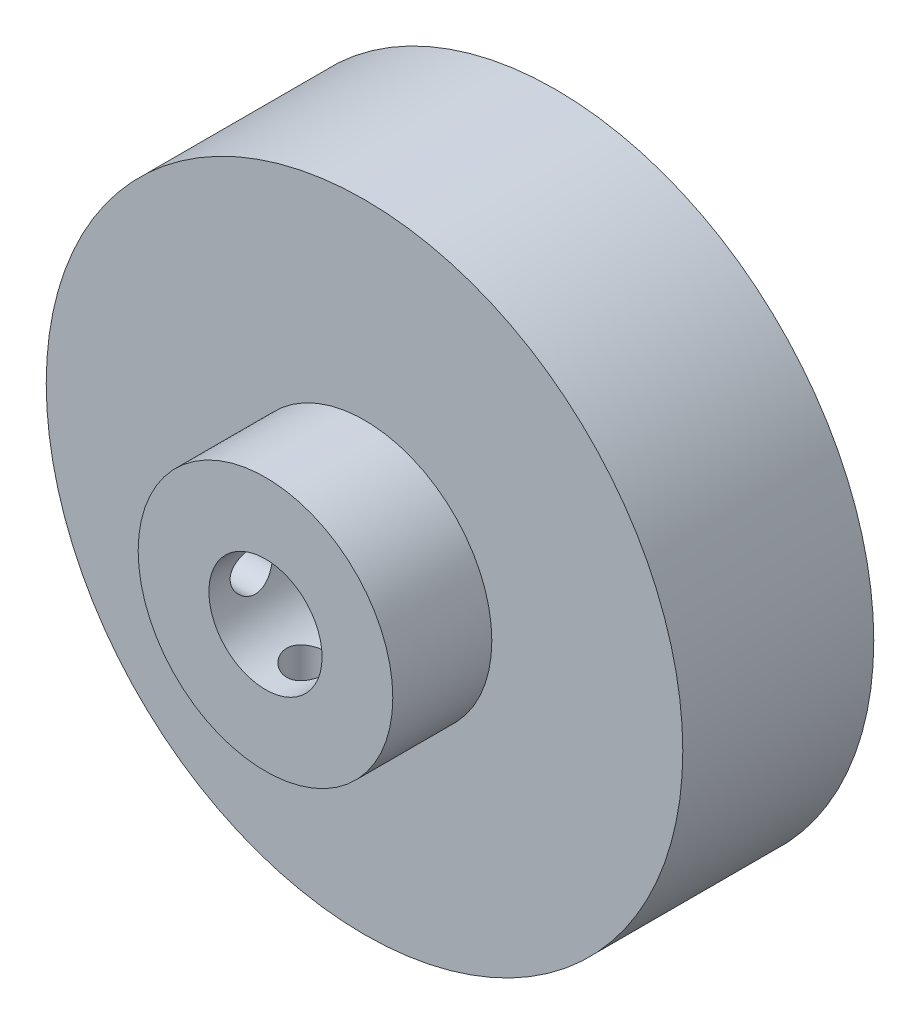
ISO-10303-21;
HEADER;
FILE_DESCRIPTION(('STEP AP214'),'2;1');
FILE_NAME('part.step','',(''),(''),'','','');
FILE_SCHEMA(('AUTOMOTIVE_DESIGN { 1 0 10303 214 1 1 1 1 }'));
ENDSEC;
DATA;
#1=APPLICATION_CONTEXT('core data for automotive mechanical design processes');
#2=APPLICATION_PROTOCOL_DEFINITION('international standard','automotive_design',2000,#1);
#3=PRODUCT_CONTEXT('',#1,'mechanical');
#4=PRODUCT('Part','Part','',(#3));
#5=PRODUCT_RELATED_PRODUCT_CATEGORY('part','',(#4));
#6=PRODUCT_DEFINITION_FORMATION('','',#4);
#7=PRODUCT_DEFINITION_CONTEXT('part definition',#1,'design');
#8=PRODUCT_DEFINITION('design','',#6,#7);
#9=PRODUCT_DEFINITION_SHAPE('','',#8);
#10=(LENGTH_UNIT() NAMED_UNIT(*) SI_UNIT(.MILLI.,.METRE.));
#11=(NAMED_UNIT(*) PLANE_ANGLE_UNIT() SI_UNIT($,.RADIAN.));
#12=(NAMED_UNIT(*) SI_UNIT($,.STERADIAN.) SOLID_ANGLE_UNIT());
#13=UNCERTAINTY_MEASURE_WITH_UNIT(LENGTH_MEASURE(1.E-05),#10,'distance_accuracy_value','');
#14=(GEOMETRIC_REPRESENTATION_CONTEXT(3) GLOBAL_UNCERTAINTY_ASSIGNED_CONTEXT((#13)) GLOBAL_UNIT_ASSIGNED_CONTEXT((#10,
#11,#12)) REPRESENTATION_CONTEXT('',''));
#15=CARTESIAN_POINT('',(0.,0.,0.));
#16=DIRECTION('',(0.,0.,1.));
#17=DIRECTION('',(1.,0.,0.));
#18=AXIS2_PLACEMENT_3D('',#15,#16,#17);
#19=CARTESIAN_POINT('',(0.,0.,13.5));
#20=DIRECTION('',(0.,0.,1.));
#21=DIRECTION('',(1.,0.,0.));
#22=AXIS2_PLACEMENT_3D('',#19,#20,#21);
#23=PLANE('',#22);
#24=CARTESIAN_POINT('',(0.,0.,13.5));
#25=DIRECTION('',(0.,0.,1.));
#26=DIRECTION('',(1.,0.,0.));
#27=AXIS2_PLACEMENT_3D('',#24,#25,#26);
#28=CIRCLE('',#27,22.5);
#29=CARTESIAN_POINT('',(22.5,0.,13.5));
#30=VERTEX_POINT('',#29);
#31=EDGE_CURVE('E10',#30,#30,#28,.T.);
#32=ORIENTED_EDGE('',*,*,#31,.T.);
#33=EDGE_LOOP('',(#32));
#34=FACE_BOUND('',#33,.T.);
#35=CARTESIAN_POINT('',(0.,0.,13.5));
#36=DIRECTION('',(0.,0.,1.));
#37=DIRECTION('',(1.,0.,0.));
#38=AXIS2_PLACEMENT_3D('',#35,#36,#37);
#39=CIRCLE('',#38,9.);
#40=CARTESIAN_POINT('',(9.,0.,13.5));
#41=VERTEX_POINT('',#40);
#42=EDGE_CURVE('E50',#41,#41,#39,.T.);
#43=ORIENTED_EDGE('',*,*,#42,.F.);
#44=EDGE_LOOP('',(#43));
#45=FACE_BOUND('',#44,.T.);
#46=ADVANCED_FACE('F30',(#34,#45),#23,.T.);
#47=CARTESIAN_POINT('',(0.,0.,13.5));
#48=DIRECTION('',(0.,0.,-1.));
#49=DIRECTION('',(-1.,0.,0.));
#50=AXIS2_PLACEMENT_3D('',#47,#48,#49);
#51=CYLINDRICAL_SURFACE('',#50,22.5);
#52=ORIENTED_EDGE('',*,*,#31,.F.);
#53=EDGE_LOOP('',(#52));
#54=FACE_BOUND('',#53,.T.);
#55=CARTESIAN_POINT('',(0.,0.,0.));
#56=DIRECTION('',(0.,0.,1.));
#57=DIRECTION('',(1.,0.,0.));
#58=AXIS2_PLACEMENT_3D('',#55,#56,#57);
#59=CIRCLE('',#58,22.5);
#60=CARTESIAN_POINT('',(22.5,0.,0.));
#61=VERTEX_POINT('',#60);
#62=EDGE_CURVE('E42',#61,#61,#59,.T.);
#63=ORIENTED_EDGE('',*,*,#62,.T.);
#64=EDGE_LOOP('',(#63));
#65=FACE_BOUND('',#64,.T.);
#66=ADVANCED_FACE('F32',(#54,#65),#51,.T.);
#67=CARTESIAN_POINT('',(0.,0.,0.));
#68=DIRECTION('',(0.,0.,1.));
#69=DIRECTION('',(1.,0.,0.));
#70=AXIS2_PLACEMENT_3D('',#67,#68,#69);
#71=PLANE('',#70);
#72=CARTESIAN_POINT('',(0.,0.,0.));
#73=DIRECTION('',(0.,0.,1.));
#74=DIRECTION('',(1.,0.,0.));
#75=AXIS2_PLACEMENT_3D('',#72,#73,#74);
#76=CIRCLE('',#75,4.);
#77=CARTESIAN_POINT('',(4.,0.,0.));
#78=VERTEX_POINT('',#77);
#79=EDGE_CURVE('E79',#78,#78,#76,.T.);
#80=ORIENTED_EDGE('',*,*,#79,.T.);
#81=EDGE_LOOP('',(#80));
#82=FACE_BOUND('',#81,.T.);
#83=ORIENTED_EDGE('',*,*,#62,.F.);
#84=EDGE_LOOP('',(#83));
#85=FACE_BOUND('',#84,.T.);
#86=ADVANCED_FACE('F86',(#82,#85),#71,.F.);
#87=CARTESIAN_POINT('',(0.,0.,20.5));
#88=DIRECTION('',(0.,0.,-1.));
#89=DIRECTION('',(-1.,0.,0.));
#90=AXIS2_PLACEMENT_3D('',#87,#88,#89);
#91=CYLINDRICAL_SURFACE('',#90,9.);
#92=CARTESIAN_POINT('',(-9.,0.,19.));
#93=CARTESIAN_POINT('',(-8.99999856701294,-0.0836345429749289,18.9999966466313));
#94=CARTESIAN_POINT('',(-8.9988220674782,-0.167314729103292,18.9929816350186));
#95=CARTESIAN_POINT('',(-8.99424206964832,-0.332328133003825,18.9651186047408));
#96=CARTESIAN_POINT('',(-8.99083652354334,-0.413659120775548,18.944257865853));
#97=CARTESIAN_POINT('',(-8.9821804094187,-0.571562848327586,18.8893507308443));
#98=CARTESIAN_POINT('',(-8.97693135095516,-0.64813942105914,18.8553151206157));
#99=CARTESIAN_POINT('',(-8.96516536249242,-0.794485105186767,18.7750526247686));
#100=CARTESIAN_POINT('',(-8.9586485775266,-0.864254993927154,18.7288271335102));
#101=CARTESIAN_POINT('',(-8.94499990474988,-0.995683568575007,18.6250269497077));
#102=CARTESIAN_POINT('',(-8.93786323088914,-1.05726774212098,18.5673585312183));
#103=CARTESIAN_POINT('',(-8.92381576126039,-1.16993309919596,18.4425112189163));
#104=CARTESIAN_POINT('',(-8.916904979776,-1.22101361963458,18.375331725126));
#105=CARTESIAN_POINT('',(-8.90404539455868,-1.31152027536308,18.2328574202818));
#106=CARTESIAN_POINT('',(-8.89810277454982,-1.3508727317166,18.1575151979171));
#107=CARTESIAN_POINT('',(-8.88791873876805,-1.41633501924673,18.0011742614196));
#108=CARTESIAN_POINT('',(-8.88367720808584,-1.44244574493937,17.9201759297934));
#109=CARTESIAN_POINT('',(-8.87742322105653,-1.48044862667089,17.7556118350861));
#110=CARTESIAN_POINT('',(-8.8753906109142,-1.49246941748124,17.6720765580992));
#111=CARTESIAN_POINT('',(-8.87372363361989,-1.50235003517393,17.5041518338699));
#112=CARTESIAN_POINT('',(-8.87408909674328,-1.5002108642334,17.4197624474996));
#113=CARTESIAN_POINT('',(-8.87715857318133,-1.48193705903769,17.2534432832347));
#114=CARTESIAN_POINT('',(-8.8798384399135,-1.46594692913386,17.1714971178729));
#115=CARTESIAN_POINT('',(-8.88719697126605,-1.42065188424207,17.0114672093025));
#116=CARTESIAN_POINT('',(-8.89187570443963,-1.39134651259184,16.9333835986669));
#117=CARTESIAN_POINT('',(-8.9027308760046,-1.32010634765635,16.7828627059354));
#118=CARTESIAN_POINT('',(-8.90891440264395,-1.27811154832783,16.7104543563513));
#119=CARTESIAN_POINT('',(-8.92207751049005,-1.18272721053446,16.573657359677));
#120=CARTESIAN_POINT('',(-8.92905715592572,-1.12933675239257,16.509269360527));
#121=CARTESIAN_POINT('',(-8.94313216727871,-1.01188932729544,16.3895043485156));
#122=CARTESIAN_POINT('',(-8.95022789538991,-0.94770837832388,16.334248888876));
#123=CARTESIAN_POINT('',(-8.96365560838034,-0.810921149388992,16.2352733424008));
#124=CARTESIAN_POINT('',(-8.96998758833847,-0.738314815143857,16.1915533298901));
#125=CARTESIAN_POINT('',(-8.98118335735747,-0.58662354970003,16.1168786637182));
#126=CARTESIAN_POINT('',(-8.98604591044468,-0.5075332353388,16.0859347484012));
#127=CARTESIAN_POINT('',(-8.99374501807596,-0.345179007361641,16.0378034708524));
#128=CARTESIAN_POINT('',(-8.99658174210284,-0.261915443507683,16.0206149578158));
#129=CARTESIAN_POINT('',(-8.99988677905612,-0.0946259407809758,16.0006471849233));
#130=CARTESIAN_POINT('',(-9.00038251807671,-0.0106204422906083,15.9977010569166));
#131=CARTESIAN_POINT('',(-8.99902484652702,0.156683863733931,16.0058568066569));
#132=CARTESIAN_POINT('',(-8.99717152634471,0.239982698335222,16.0169581438802));
#133=CARTESIAN_POINT('',(-8.99134096162921,0.402993705328058,16.0527549096013));
#134=CARTESIAN_POINT('',(-8.98737662880787,0.482724521031227,16.0773677250341));
#135=CARTESIAN_POINT('',(-8.97776678673215,0.636928130916265,16.1394007109197));
#136=CARTESIAN_POINT('',(-8.97212118307212,0.71140062954583,16.1768216005812));
#137=CARTESIAN_POINT('',(-8.95970709781445,0.853698413681374,16.2637906748181));
#138=CARTESIAN_POINT('',(-8.95292913532213,0.921459150562287,16.3134430937004));
#139=CARTESIAN_POINT('',(-8.93903080435141,1.04774615130161,16.423322389231));
#140=CARTESIAN_POINT('',(-8.93191041102928,1.10627174381795,16.483550033966));
#141=CARTESIAN_POINT('',(-8.91804105141507,1.2130456677948,16.6136185288429));
#142=CARTESIAN_POINT('',(-8.91129669682264,1.26118125666823,16.6835524993086));
#143=CARTESIAN_POINT('',(-8.8990291786673,1.34502138617699,16.8306117814831));
#144=CARTESIAN_POINT('',(-8.89350597639612,1.38072632086189,16.9077368651365));
#145=CARTESIAN_POINT('',(-8.88434072218623,1.43852299888389,17.0666738396873));
#146=CARTESIAN_POINT('',(-8.88069092586639,1.46067085952877,17.1484648570183));
#147=CARTESIAN_POINT('',(-8.87566630101156,1.49090127226697,17.3146720775331));
#148=CARTESIAN_POINT('',(-8.87429127469633,1.4989850471677,17.3990880518392));
#149=CARTESIAN_POINT('',(-8.87398039850407,1.50082371962841,17.5670230995774));
#150=CARTESIAN_POINT('',(-8.8750143390339,1.49475608167511,17.6505402271452));
#151=CARTESIAN_POINT('',(-8.87933868872237,1.46884790337411,17.8153475488305));
#152=CARTESIAN_POINT('',(-8.88262909056728,1.44900740766749,17.8966377501651));
#153=CARTESIAN_POINT('',(-8.89108413769031,1.39618469375694,18.0546150623756));
#154=CARTESIAN_POINT('',(-8.89624660331802,1.36321775436027,18.1313074060336));
#155=CARTESIAN_POINT('',(-8.90786621353324,1.28509620234955,18.2781014015169));
#156=CARTESIAN_POINT('',(-8.91432342233039,1.23994098524914,18.3482027262233));
#157=CARTESIAN_POINT('',(-8.92790072427373,1.13809133062329,18.4807213498647));
#158=CARTESIAN_POINT('',(-8.93502777345781,1.08126633815619,18.5430376100202));
#159=CARTESIAN_POINT('',(-8.94908623416505,0.957965418828139,18.657310962685));
#160=CARTESIAN_POINT('',(-8.95601760015928,0.891487267747582,18.7092656611829));
#161=CARTESIAN_POINT('',(-8.96895917785332,0.750221501784169,18.80166896092));
#162=CARTESIAN_POINT('',(-8.97496269751862,0.675379672519692,18.8420356235878));
#163=CARTESIAN_POINT('',(-8.98530700561065,0.51990784162739,18.909561690766));
#164=CARTESIAN_POINT('',(-8.98964944906489,0.439283696898006,18.9367342486478));
#165=CARTESIAN_POINT('',(-8.99523474499773,0.298621986027241,18.971203164476));
#166=CARTESIAN_POINT('',(-8.99701216364015,0.239435298179069,18.9819846817696));
#167=CARTESIAN_POINT('',(-8.99939529591672,0.120173586191886,18.9963842427069));
#168=CARTESIAN_POINT('',(-9.00000102972385,0.0600985773650966,19.0000024096824));
#169=CARTESIAN_POINT('',(-9.,0.,19.));
#170=B_SPLINE_CURVE_WITH_KNOTS('',3,(#92,#93,#94,#95,#96,#97,#98,#99,#100,#101,#102,#103,#104,
#105,#106,#107,#108,#109,#110,#111,#112,#113,#114,#115,#116,#117,#118,#119,#120,#121,#122,#123,
#124,#125,#126,#127,#128,#129,#130,#131,#132,#133,#134,#135,#136,#137,#138,#139,#140,#141,#142,
#143,#144,#145,#146,#147,#148,#149,#150,#151,#152,#153,#154,#155,#156,#157,#158,#159,#160,#161,
#162,#163,#164,#165,#166,#167,#168,#169),.UNSPECIFIED.,.T.,.F.,(4,2,2,2,2,2,2,2,2,2,2,2,2,2,2,2,
2,2,2,2,2,2,2,2,2,2,2,2,2,2,2,2,2,2,2,2,2,2,4),(0.,0.250683950963106,0.501598527417252,
0.752308120215162,1.00298904760487,1.25581494637399,1.50865680101914,1.76305512494304,
2.01743626125709,2.26947646262054,2.52149882592532,2.77092313056246,3.02035599015229,
3.27098733979535,3.52163892408344,3.77539661946796,4.02915594981508,4.28312813349542,
4.53707906712689,4.78804730094838,5.03900587821516,5.2884468420385,5.5379018149564,
5.78956095376215,6.0412383783257,6.29552293204572,6.54979942425566,6.80301613405064,
7.05621082671971,7.3062474571362,7.5562832771288,7.80602890935734,8.05578693017602,
8.30850830516036,8.56128800327384,8.8158133896432,9.07008451278043,9.25022548898411,
9.43036336366181),.UNSPECIFIED.);
#171=CARTESIAN_POINT('',(-9.,0.,19.));
#172=VERTEX_POINT('',#171);
#173=EDGE_CURVE('E58',#172,#172,#170,.T.);
#174=ORIENTED_EDGE('',*,*,#173,.T.);
#175=EDGE_LOOP('',(#174));
#176=FACE_BOUND('',#175,.T.);
#177=CARTESIAN_POINT('',(0.,-9.,19.));
#178=CARTESIAN_POINT('',(0.0836345429749311,-8.99999856701294,18.9999966466313));
#179=CARTESIAN_POINT('',(0.167314729103295,-8.9988220674782,18.9929816350187));
#180=CARTESIAN_POINT('',(0.332328133003828,-8.99424206964832,18.9651186047408));
#181=CARTESIAN_POINT('',(0.413659120775551,-8.99083652354334,18.944257865853));
#182=CARTESIAN_POINT('',(0.571562848327589,-8.9821804094187,18.8893507308443));
#183=CARTESIAN_POINT('',(0.648139421059144,-8.97693135095516,18.8553151206157));
#184=CARTESIAN_POINT('',(0.794485105186771,-8.96516536249242,18.7750526247686));
#185=CARTESIAN_POINT('',(0.864254993927159,-8.9586485775266,18.7288271335102));
#186=CARTESIAN_POINT('',(0.995683568575012,-8.94499990474988,18.6250269497077));
#187=CARTESIAN_POINT('',(1.05726774212098,-8.93786323088914,18.5673585312183));
#188=CARTESIAN_POINT('',(1.16993309919596,-8.92381576126039,18.4425112189163));
#189=CARTESIAN_POINT('',(1.22101361963459,-8.916904979776,18.375331725126));
#190=CARTESIAN_POINT('',(1.31152027536308,-8.90404539455868,18.2328574202818));
#191=CARTESIAN_POINT('',(1.3508727317166,-8.89810277454981,18.1575151979171));
#192=CARTESIAN_POINT('',(1.41633501924674,-8.88791873876805,18.0011742614196));
#193=CARTESIAN_POINT('',(1.44244574493937,-8.88367720808584,17.9201759297934));
#194=CARTESIAN_POINT('',(1.48044862667089,-8.87742322105653,17.7556118350861));
#195=CARTESIAN_POINT('',(1.49246941748125,-8.8753906109142,17.6720765580992));
#196=CARTESIAN_POINT('',(1.50235003517393,-8.87372363361989,17.5041518338699));
#197=CARTESIAN_POINT('',(1.5002108642334,-8.87408909674328,17.4197624474996));
#198=CARTESIAN_POINT('',(1.4819370590377,-8.87715857318133,17.2534432832347));
#199=CARTESIAN_POINT('',(1.46594692913387,-8.8798384399135,17.1714971178729));
#200=CARTESIAN_POINT('',(1.42065188424207,-8.88719697126605,17.0114672093025));
#201=CARTESIAN_POINT('',(1.39134651259185,-8.89187570443963,16.9333835986669));
#202=CARTESIAN_POINT('',(1.32010634765635,-8.9027308760046,16.7828627059354));
#203=CARTESIAN_POINT('',(1.27811154832783,-8.90891440264395,16.7104543563513));
#204=CARTESIAN_POINT('',(1.18272721053446,-8.92207751049005,16.573657359677));
#205=CARTESIAN_POINT('',(1.12933675239257,-8.92905715592572,16.509269360527));
#206=CARTESIAN_POINT('',(1.01188932729544,-8.94313216727871,16.3895043485156));
#207=CARTESIAN_POINT('',(0.94770837832388,-8.95022789538991,16.334248888876));
#208=CARTESIAN_POINT('',(0.810921149388991,-8.96365560838034,16.2352733424008));
#209=CARTESIAN_POINT('',(0.738314815143856,-8.96998758833847,16.1915533298901));
#210=CARTESIAN_POINT('',(0.586623549700029,-8.98118335735747,16.1168786637182));
#211=CARTESIAN_POINT('',(0.507533235338799,-8.98604591044468,16.0859347484012));
#212=CARTESIAN_POINT('',(0.345179007361641,-8.99374501807596,16.0378034708524));
#213=CARTESIAN_POINT('',(0.261915443507683,-8.99658174210284,16.0206149578158));
#214=CARTESIAN_POINT('',(0.0946259407809755,-8.99988677905612,16.0006471849233));
#215=CARTESIAN_POINT('',(0.0106204422906077,-9.00038251807671,15.9977010569166));
#216=CARTESIAN_POINT('',(-0.156683863733932,-8.99902484652702,16.0058568066569));
#217=CARTESIAN_POINT('',(-0.239982698335223,-8.99717152634471,16.0169581438802));
#218=CARTESIAN_POINT('',(-0.402993705328058,-8.99134096162921,16.0527549096013));
#219=CARTESIAN_POINT('',(-0.482724521031227,-8.98737662880787,16.0773677250341));
#220=CARTESIAN_POINT('',(-0.636928130916266,-8.97776678673215,16.1394007109197));
#221=CARTESIAN_POINT('',(-0.711400629545831,-8.97212118307212,16.1768216005812));
#222=CARTESIAN_POINT('',(-0.853698413681375,-8.95970709781444,16.2637906748181));
#223=CARTESIAN_POINT('',(-0.921459150562288,-8.95292913532213,16.3134430937004));
#224=CARTESIAN_POINT('',(-1.04774615130161,-8.93903080435141,16.423322389231));
#225=CARTESIAN_POINT('',(-1.10627174381795,-8.93191041102928,16.483550033966));
#226=CARTESIAN_POINT('',(-1.2130456677948,-8.91804105141507,16.6136185288429));
#227=CARTESIAN_POINT('',(-1.26118125666823,-8.91129669682264,16.6835524993086));
#228=CARTESIAN_POINT('',(-1.34502138617699,-8.8990291786673,16.8306117814831));
#229=CARTESIAN_POINT('',(-1.38072632086189,-8.89350597639612,16.9077368651365));
#230=CARTESIAN_POINT('',(-1.43852299888389,-8.88434072218623,17.0666738396873));
#231=CARTESIAN_POINT('',(-1.46067085952877,-8.88069092586639,17.1484648570183));
#232=CARTESIAN_POINT('',(-1.49090127226697,-8.87566630101156,17.3146720775331));
#233=CARTESIAN_POINT('',(-1.4989850471677,-8.87429127469633,17.3990880518392));
#234=CARTESIAN_POINT('',(-1.50082371962841,-8.87398039850407,17.5670230995775));
#235=CARTESIAN_POINT('',(-1.49475608167511,-8.8750143390339,17.6505402271452));
#236=CARTESIAN_POINT('',(-1.46884790337411,-8.87933868872237,17.8153475488305));
#237=CARTESIAN_POINT('',(-1.44900740766749,-8.88262909056728,17.8966377501651));
#238=CARTESIAN_POINT('',(-1.39618469375694,-8.89108413769031,18.0546150623756));
#239=CARTESIAN_POINT('',(-1.36321775436026,-8.89624660331802,18.1313074060336));
#240=CARTESIAN_POINT('',(-1.28509620234954,-8.90786621353324,18.2781014015169));
#241=CARTESIAN_POINT('',(-1.23994098524914,-8.9143234223304,18.3482027262233));
#242=CARTESIAN_POINT('',(-1.13809133062329,-8.92790072427373,18.4807213498647));
#243=CARTESIAN_POINT('',(-1.08126633815619,-8.93502777345781,18.5430376100202));
#244=CARTESIAN_POINT('',(-0.957965418828136,-8.94908623416504,18.657310962685));
#245=CARTESIAN_POINT('',(-0.89148726774758,-8.95601760015928,18.7092656611829));
#246=CARTESIAN_POINT('',(-0.750221501784167,-8.96895917785332,18.80166896092));
#247=CARTESIAN_POINT('',(-0.675379672519689,-8.97496269751862,18.8420356235878));
#248=CARTESIAN_POINT('',(-0.519907841627385,-8.98530700561065,18.909561690766));
#249=CARTESIAN_POINT('',(-0.439283696898002,-8.98964944906489,18.9367342486478));
#250=CARTESIAN_POINT('',(-0.298621986027236,-8.99523474499773,18.971203164476));
#251=CARTESIAN_POINT('',(-0.239435298179064,-8.99701216364015,18.9819846817696));
#252=CARTESIAN_POINT('',(-0.120173586191882,-8.99939529591673,18.9963842427069));
#253=CARTESIAN_POINT('',(-0.0600985773650939,-9.00000102972385,19.0000024096824));
#254=CARTESIAN_POINT('',(0.,-9.,19.));
#255=B_SPLINE_CURVE_WITH_KNOTS('',3,(#177,#178,#179,#180,#181,#182,#183,#184,#185,#186,#187,
#188,#189,#190,#191,#192,#193,#194,#195,#196,#197,#198,#199,#200,#201,#202,#203,#204,#205,#206,
#207,#208,#209,#210,#211,#212,#213,#214,#215,#216,#217,#218,#219,#220,#221,#222,#223,#224,#225,
#226,#227,#228,#229,#230,#231,#232,#233,#234,#235,#236,#237,#238,#239,#240,#241,#242,#243,#244,
#245,#246,#247,#248,#249,#250,#251,#252,#253,#254),.UNSPECIFIED.,.T.,.F.,(4,2,2,2,2,2,2,2,2,2,2,
2,2,2,2,2,2,2,2,2,2,2,2,2,2,2,2,2,2,2,2,2,2,2,2,2,2,2,4),(0.,0.250683950963106,
0.501598527417254,0.752308120215164,1.00298904760488,1.255814946374,1.50865680101914,
1.76305512494304,2.01743626125709,2.26947646262055,2.52149882592532,2.77092313056246,
3.0203559901523,3.27098733979535,3.52163892408345,3.77539661946796,4.02915594981509,
4.28312813349543,4.5370790671269,4.78804730094839,5.03900587821517,5.2884468420385,
5.53790181495641,5.78956095376215,6.04123837832571,6.29552293204572,6.54979942425567,
6.80301613405065,7.05621082671972,7.30624745713622,7.55628327712881,7.80602890935735,
8.05578693017603,8.30850830516036,8.56128800327385,8.81581338964322,9.07008451278045,
9.25022548898413,9.43036336366182),.UNSPECIFIED.);
#256=CARTESIAN_POINT('',(0.,-9.,19.));
#257=VERTEX_POINT('',#256);
#258=EDGE_CURVE('E57',#257,#257,#255,.T.);
#259=ORIENTED_EDGE('',*,*,#258,.T.);
#260=EDGE_LOOP('',(#259));
#261=FACE_BOUND('',#260,.T.);
#262=CARTESIAN_POINT('',(0.,0.,20.5));
#263=DIRECTION('',(0.,0.,1.));
#264=DIRECTION('',(1.,0.,0.));
#265=AXIS2_PLACEMENT_3D('',#262,#263,#264);
#266=CIRCLE('',#265,9.);
#267=CARTESIAN_POINT('',(9.,0.,20.5));
#268=VERTEX_POINT('',#267);
#269=EDGE_CURVE('E47',#268,#268,#266,.T.);
#270=ORIENTED_EDGE('',*,*,#269,.F.);
#271=EDGE_LOOP('',(#270));
#272=FACE_BOUND('',#271,.T.);
#273=ORIENTED_EDGE('',*,*,#42,.T.);
#274=EDGE_LOOP('',(#273));
#275=FACE_BOUND('',#274,.T.);
#276=ADVANCED_FACE('F81',(#176,#261,#272,#275),#91,.T.);
#277=CARTESIAN_POINT('',(0.,0.,20.5));
#278=DIRECTION('',(0.,0.,1.));
#279=DIRECTION('',(1.,0.,0.));
#280=AXIS2_PLACEMENT_3D('',#277,#278,#279);
#281=PLANE('',#280);
#282=CARTESIAN_POINT('',(0.,0.,20.5));
#283=DIRECTION('',(0.,0.,1.));
#284=DIRECTION('',(1.,0.,0.));
#285=AXIS2_PLACEMENT_3D('',#282,#283,#284);
#286=CIRCLE('',#285,4.);
#287=CARTESIAN_POINT('',(4.,0.,20.5));
#288=VERTEX_POINT('',#287);
#289=EDGE_CURVE('E76',#288,#288,#286,.T.);
#290=ORIENTED_EDGE('',*,*,#289,.F.);
#291=EDGE_LOOP('',(#290));
#292=FACE_BOUND('',#291,.T.);
#293=ORIENTED_EDGE('',*,*,#269,.T.);
#294=EDGE_LOOP('',(#293));
#295=FACE_BOUND('',#294,.T.);
#296=ADVANCED_FACE('F85',(#292,#295),#281,.T.);
#297=CARTESIAN_POINT('',(0.,0.,0.));
#298=DIRECTION('',(0.,0.,1.));
#299=DIRECTION('',(1.,0.,0.));
#300=AXIS2_PLACEMENT_3D('',#297,#298,#299);
#301=CYLINDRICAL_SURFACE('',#300,4.);
#302=CARTESIAN_POINT('',(-4.,0.,16.));
#303=CARTESIAN_POINT('',(-4.00000217456152,-0.0812350589378531,15.9999970976969));
#304=CARTESIAN_POINT('',(-3.99750379283184,-0.162450241781792,16.0066197602484));
#305=CARTESIAN_POINT('',(-3.98778696006928,-0.322453452352361,16.0328281952699));
#306=CARTESIAN_POINT('',(-3.98056918893993,-0.401241827987615,16.0524121004706));
#307=CARTESIAN_POINT('',(-3.96218832391545,-0.554060784990878,16.1037530017718));
#308=CARTESIAN_POINT('',(-3.9510328434944,-0.628100224162276,16.1354865168218));
#309=CARTESIAN_POINT('',(-3.92588767765353,-0.769799310160252,16.2101064130158));
#310=CARTESIAN_POINT('',(-3.91189723227548,-0.837457239177878,16.2529957855442));
#311=CARTESIAN_POINT('',(-3.88186246971217,-0.967346417045824,16.3506125310709));
#312=CARTESIAN_POINT('',(-3.86576002583566,-1.02927073015119,16.4057302622594));
#313=CARTESIAN_POINT('',(-3.83360220871327,-1.14324421474363,16.5254104346588));
#314=CARTESIAN_POINT('',(-3.81754685135033,-1.19529036359202,16.5899757560879));
#315=CARTESIAN_POINT('',(-3.78662470617731,-1.28998202215985,16.7297174675232));
#316=CARTESIAN_POINT('',(-3.77182648820818,-1.3321939319576,16.8052043665458));
#317=CARTESIAN_POINT('',(-3.74599860237433,-1.40318646334084,16.9628483541685));
#318=CARTESIAN_POINT('',(-3.73496742975881,-1.43197244961239,17.0450027631551));
#319=CARTESIAN_POINT('',(-3.71854412824136,-1.47408431017549,17.2101167402582));
#320=CARTESIAN_POINT('',(-3.71293924350838,-1.48799593218558,17.2929050384354));
#321=CARTESIAN_POINT('',(-3.70738061461215,-1.50179556531648,17.4598161579938));
#322=CARTESIAN_POINT('',(-3.70742453659305,-1.50168936802631,17.5439384138745));
#323=CARTESIAN_POINT('',(-3.71297511632055,-1.48790429610018,17.705769525213));
#324=CARTESIAN_POINT('',(-3.71815468871122,-1.47503808509004,17.7835609060442));
#325=CARTESIAN_POINT('',(-3.73284938059529,-1.4374416786833,17.9357871504053));
#326=CARTESIAN_POINT('',(-3.74236515298863,-1.41270969663258,18.0102215066139));
#327=CARTESIAN_POINT('',(-3.76485702190253,-1.35163748571904,18.1552770677282));
#328=CARTESIAN_POINT('',(-3.77789517988166,-1.31508648737101,18.2257994861213));
#329=CARTESIAN_POINT('',(-3.80594210139319,-1.23156073762698,18.359945737591));
#330=CARTESIAN_POINT('',(-3.82095154457158,-1.18458238728897,18.4235671775197));
#331=CARTESIAN_POINT('',(-3.85248038859113,-1.07781780766549,18.5466036636509));
#332=CARTESIAN_POINT('',(-3.86903347455671,-1.01738298716956,18.6054486407481));
#333=CARTESIAN_POINT('',(-3.90091728164085,-0.887312590819023,18.7123379662058));
#334=CARTESIAN_POINT('',(-3.91624781465952,-0.817675603497366,18.7603806546057));
#335=CARTESIAN_POINT('',(-3.9442639480908,-0.66972343699242,18.8449303970625));
#336=CARTESIAN_POINT('',(-3.95690498259616,-0.59129071384472,18.8812475812211));
#337=CARTESIAN_POINT('',(-3.97778718326962,-0.428836850524585,18.93998260427));
#338=CARTESIAN_POINT('',(-3.98603030341493,-0.344818210845769,18.9624066165611));
#339=CARTESIAN_POINT('',(-3.99684443228065,-0.178375243148668,18.9916227875419));
#340=CARTESIAN_POINT('',(-3.99969369025686,-0.0961036195622122,18.9991826063825));
#341=CARTESIAN_POINT('',(-4.00025893700126,0.0685724752550217,19.0006910638999));
#342=CARTESIAN_POINT('',(-3.99797606386863,0.150976912983371,18.9946427203168));
#343=CARTESIAN_POINT('',(-3.98871709772643,0.310262048561857,18.9696899576913));
#344=CARTESIAN_POINT('',(-3.98192470962305,0.387233328007334,18.9512884562629));
#345=CARTESIAN_POINT('',(-3.96451477091717,0.536941754957218,18.9028139274527));
#346=CARTESIAN_POINT('',(-3.9538967228203,0.609678350347531,18.872739382052));
#347=CARTESIAN_POINT('',(-3.92949624407682,0.751247765110153,18.8008135875605));
#348=CARTESIAN_POINT('',(-3.91563000209348,0.819903083557793,18.7586422707766));
#349=CARTESIAN_POINT('',(-3.88626671564664,0.949392711726624,18.6640818968284));
#350=CARTESIAN_POINT('',(-3.87076907009516,1.01022412027045,18.6116890674549));
#351=CARTESIAN_POINT('',(-3.8387332949099,1.12603079874454,18.4945958778757));
#352=CARTESIAN_POINT('',(-3.82218696503729,1.18046154123568,18.4293578172273));
#353=CARTESIAN_POINT('',(-3.79078815746854,1.27771050031903,18.2903486152923));
#354=CARTESIAN_POINT('',(-3.77593583194399,1.32052767414518,18.2165767086115));
#355=CARTESIAN_POINT('',(-3.74966829822463,1.39337773518998,18.0619840132277));
#356=CARTESIAN_POINT('',(-3.73826760328493,1.42335685446918,17.9811352540896));
#357=CARTESIAN_POINT('',(-3.72054032891005,1.46907883466889,17.8149902363122));
#358=CARTESIAN_POINT('',(-3.71421061057491,1.48483050305535,17.7296967638019));
#359=CARTESIAN_POINT('',(-3.70775894792573,1.50086347097839,17.5629838404589));
#360=CARTESIAN_POINT('',(-3.70726444523341,1.50207331495837,17.4816673682831));
#361=CARTESIAN_POINT('',(-3.71158412745292,1.49136715641593,17.3200546837238));
#362=CARTESIAN_POINT('',(-3.71639780898899,1.47945239850124,17.2397583753284));
#363=CARTESIAN_POINT('',(-3.73048141585432,1.44355815630242,17.0849527732834));
#364=CARTESIAN_POINT('',(-3.73961085376663,1.41995798316524,17.0103416537547));
#365=CARTESIAN_POINT('',(-3.76121548297845,1.3616969677992,16.8660944915056));
#366=CARTESIAN_POINT('',(-3.77369151995215,1.32703332944945,16.7964597119299));
#367=CARTESIAN_POINT('',(-3.80139723903965,1.24552075938154,16.6601732103024));
#368=CARTESIAN_POINT('',(-3.81673698440964,1.1981283280301,16.5938692032001));
#369=CARTESIAN_POINT('',(-3.84806246757177,1.09334485729906,16.4698584390288));
#370=CARTESIAN_POINT('',(-3.86404840943145,1.03595064012808,16.4121544252132));
#371=CARTESIAN_POINT('',(-3.89590424609881,0.909080396784623,16.3037980441782));
#372=CARTESIAN_POINT('',(-3.91172104900645,0.839118644212993,16.2536962465653));
#373=CARTESIAN_POINT('',(-3.94054514457031,0.691213223200822,16.1659773447234));
#374=CARTESIAN_POINT('',(-3.95355221851559,0.613268934090622,16.1283612122636));
#375=CARTESIAN_POINT('',(-3.9757429260668,0.447999082002312,16.0656231709517));
#376=CARTESIAN_POINT('',(-3.98473657158356,0.360413422234208,16.0411129353981));
#377=CARTESIAN_POINT('',(-3.99686242179587,0.181875733606381,16.0083070400793));
#378=CARTESIAN_POINT('',(-3.99999756603967,0.0909254163648582,16.0000032485127));
#379=CARTESIAN_POINT('',(-4.,0.,16.));
#380=B_SPLINE_CURVE_WITH_KNOTS('',3,(#302,#303,#304,#305,#306,#307,#308,#309,#310,#311,#312,
#313,#314,#315,#316,#317,#318,#319,#320,#321,#322,#323,#324,#325,#326,#327,#328,#329,#330,#331,
#332,#333,#334,#335,#336,#337,#338,#339,#340,#341,#342,#343,#344,#345,#346,#347,#348,#349,#350,
#351,#352,#353,#354,#355,#356,#357,#358,#359,#360,#361,#362,#363,#364,#365,#366,#367,#368,#369,
#370,#371,#372,#373,#374,#375,#376,#377,#378,#379),.UNSPECIFIED.,.T.,.F.,(4,2,2,2,2,2,2,2,2,2,2,
2,2,2,2,2,2,2,2,2,2,2,2,2,2,2,2,2,2,2,2,2,2,2,2,2,2,2,4),(0.,0.243369801560559,
0.486704549530459,0.729571369213571,0.972503379609487,1.22473618582715,1.47704604925621,
1.73896674501658,2.00078269352134,2.25185874416901,2.50283106079707,2.73878345119971,
2.97477138060589,3.21522408387018,3.45575990744258,3.71246153335812,3.96920257905066,
4.22991375286075,4.49050899698846,4.73725019635925,4.98393668390521,5.2211443792384,
5.45838293254454,5.702592218596,5.94689180019868,6.20536519455658,6.46386178920141,
6.72343066727204,6.98283874956507,7.22558763480252,7.46831350211259,7.70363142426534,
7.93900886656507,8.18672471884272,8.43451941997063,8.69572329654039,8.95694749805102,
9.22948515032043,9.50188601796128),.UNSPECIFIED.);
#381=CARTESIAN_POINT('',(-4.,0.,16.));
#382=VERTEX_POINT('',#381);
#383=EDGE_CURVE('E34',#382,#382,#380,.T.);
#384=ORIENTED_EDGE('',*,*,#383,.T.);
#385=EDGE_LOOP('',(#384));
#386=FACE_BOUND('',#385,.T.);
#387=CARTESIAN_POINT('',(0.,-4.,19.));
#388=CARTESIAN_POINT('',(-0.0812350589378508,-4.00000217456152,19.0000029023031));
#389=CARTESIAN_POINT('',(-0.16245024178179,-3.99750379283184,18.9933802397516));
#390=CARTESIAN_POINT('',(-0.322453452352359,-3.98778696006928,18.9671718047301));
#391=CARTESIAN_POINT('',(-0.401241827987614,-3.98056918893993,18.9475878995294));
#392=CARTESIAN_POINT('',(-0.554060784990877,-3.96218832391545,18.8962469982282));
#393=CARTESIAN_POINT('',(-0.628100224162276,-3.9510328434944,18.8645134831782));
#394=CARTESIAN_POINT('',(-0.769799310160252,-3.92588767765353,18.7898935869842));
#395=CARTESIAN_POINT('',(-0.837457239177878,-3.91189723227548,18.7470042144558));
#396=CARTESIAN_POINT('',(-0.967346417045824,-3.88186246971217,18.6493874689291));
#397=CARTESIAN_POINT('',(-1.02927073015119,-3.86576002583566,18.5942697377406));
#398=CARTESIAN_POINT('',(-1.14324421474363,-3.83360220871327,18.4745895653412));
#399=CARTESIAN_POINT('',(-1.19529036359202,-3.81754685135033,18.4100242439121));
#400=CARTESIAN_POINT('',(-1.28998202215985,-3.78662470617731,18.2702825324768));
#401=CARTESIAN_POINT('',(-1.33219393195759,-3.77182648820819,18.1947956334542));
#402=CARTESIAN_POINT('',(-1.40318646334084,-3.74599860237433,18.0371516458315));
#403=CARTESIAN_POINT('',(-1.43197244961239,-3.73496742975881,17.9549972368449));
#404=CARTESIAN_POINT('',(-1.47408431017549,-3.71854412824136,17.7898832597418));
#405=CARTESIAN_POINT('',(-1.48799593218558,-3.71293924350838,17.7070949615646));
#406=CARTESIAN_POINT('',(-1.50179556531648,-3.70738061461215,17.5401838420062));
#407=CARTESIAN_POINT('',(-1.5016893680263,-3.70742453659305,17.4560615861255));
#408=CARTESIAN_POINT('',(-1.48790429610018,-3.71297511632055,17.294230474787));
#409=CARTESIAN_POINT('',(-1.47503808509003,-3.71815468871122,17.2164390939558));
#410=CARTESIAN_POINT('',(-1.4374416786833,-3.73284938059529,17.0642128495947));
#411=CARTESIAN_POINT('',(-1.41270969663258,-3.74236515298863,16.9897784933861));
#412=CARTESIAN_POINT('',(-1.35163748571904,-3.76485702190253,16.8447229322718));
#413=CARTESIAN_POINT('',(-1.315086487371,-3.77789517988166,16.7742005138787));
#414=CARTESIAN_POINT('',(-1.23156073762697,-3.80594210139319,16.640054262409));
#415=CARTESIAN_POINT('',(-1.18458238728896,-3.82095154457158,16.5764328224803));
#416=CARTESIAN_POINT('',(-1.07781780766549,-3.85248038859113,16.4533963363491));
#417=CARTESIAN_POINT('',(-1.01738298716955,-3.86903347455671,16.3945513592519));
#418=CARTESIAN_POINT('',(-0.887312590819017,-3.90091728164086,16.2876620337942));
#419=CARTESIAN_POINT('',(-0.817675603497359,-3.91624781465952,16.2396193453943));
#420=CARTESIAN_POINT('',(-0.669723436992415,-3.9442639480908,16.1550696029375));
#421=CARTESIAN_POINT('',(-0.591290713844716,-3.95690498259616,16.1187524187789));
#422=CARTESIAN_POINT('',(-0.428836850524581,-3.97778718326962,16.06001739573));
#423=CARTESIAN_POINT('',(-0.344818210845765,-3.98603030341493,16.0375933834389));
#424=CARTESIAN_POINT('',(-0.178375243148662,-3.99684443228065,16.0083772124581));
#425=CARTESIAN_POINT('',(-0.0961036195622064,-3.99969369025686,16.0008173936175));
#426=CARTESIAN_POINT('',(0.0685724752550272,-4.00025893700126,15.9993089361001));
#427=CARTESIAN_POINT('',(0.150976912983376,-3.99797606386863,16.0053572796832));
#428=CARTESIAN_POINT('',(0.310262048561862,-3.98871709772643,16.0303100423087));
#429=CARTESIAN_POINT('',(0.387233328007339,-3.98192470962305,16.0487115437371));
#430=CARTESIAN_POINT('',(0.536941754957223,-3.96451477091717,16.0971860725473));
#431=CARTESIAN_POINT('',(0.609678350347536,-3.9538967228203,16.127260617948));
#432=CARTESIAN_POINT('',(0.751247765110158,-3.92949624407681,16.1991864124395));
#433=CARTESIAN_POINT('',(0.819903083557799,-3.91563000209348,16.2413577292234));
#434=CARTESIAN_POINT('',(0.949392711726629,-3.88626671564664,16.3359181031716));
#435=CARTESIAN_POINT('',(1.01022412027045,-3.87076907009516,16.3883109325452));
#436=CARTESIAN_POINT('',(1.12603079874455,-3.83873329490989,16.5054041221243));
#437=CARTESIAN_POINT('',(1.18046154123569,-3.82218696503729,16.5706421827727));
#438=CARTESIAN_POINT('',(1.27771050031904,-3.79078815746853,16.7096513847077));
#439=CARTESIAN_POINT('',(1.32052767414519,-3.77593583194399,16.7834232913885));
#440=CARTESIAN_POINT('',(1.39337773518998,-3.74966829822463,16.9380159867723));
#441=CARTESIAN_POINT('',(1.42335685446918,-3.73826760328493,17.0188647459104));
#442=CARTESIAN_POINT('',(1.46907883466889,-3.72054032891005,17.1850097636878));
#443=CARTESIAN_POINT('',(1.48483050305535,-3.7142106105749,17.2703032361981));
#444=CARTESIAN_POINT('',(1.50086347097839,-3.70775894792573,17.4370161595411));
#445=CARTESIAN_POINT('',(1.50207331495838,-3.70726444523341,17.5183326317169));
#446=CARTESIAN_POINT('',(1.49136715641593,-3.71158412745292,17.6799453162762));
#447=CARTESIAN_POINT('',(1.47945239850124,-3.71639780898899,17.7602416246716));
#448=CARTESIAN_POINT('',(1.44355815630242,-3.73048141585432,17.9150472267166));
#449=CARTESIAN_POINT('',(1.41995798316525,-3.73961085376663,17.9896583462453));
#450=CARTESIAN_POINT('',(1.3616969677992,-3.76121548297845,18.1339055084944));
#451=CARTESIAN_POINT('',(1.32703332944945,-3.77369151995215,18.2035402880701));
#452=CARTESIAN_POINT('',(1.24552075938154,-3.80139723903964,18.3398267896976));
#453=CARTESIAN_POINT('',(1.1981283280301,-3.81673698440964,18.4061307967999));
#454=CARTESIAN_POINT('',(1.09334485729906,-3.84806246757177,18.5301415609712));
#455=CARTESIAN_POINT('',(1.03595064012808,-3.86404840943145,18.5878455747868));
#456=CARTESIAN_POINT('',(0.909080396784623,-3.89590424609881,18.6962019558218));
#457=CARTESIAN_POINT('',(0.839118644212992,-3.91172104900645,18.7463037534347));
#458=CARTESIAN_POINT('',(0.691213223200821,-3.94054514457031,18.8340226552766));
#459=CARTESIAN_POINT('',(0.613268934090622,-3.95355221851559,18.8716387877364));
#460=CARTESIAN_POINT('',(0.447999082002314,-3.9757429260668,18.9343768290483));
#461=CARTESIAN_POINT('',(0.360413422234211,-3.98473657158356,18.9588870646019));
#462=CARTESIAN_POINT('',(0.181875733606385,-3.99686242179587,18.9916929599207));
#463=CARTESIAN_POINT('',(0.0909254163648613,-3.99999756603967,18.9999967514873));
#464=CARTESIAN_POINT('',(0.,-4.,19.));
#465=B_SPLINE_CURVE_WITH_KNOTS('',3,(#387,#388,#389,#390,#391,#392,#393,#394,#395,#396,#397,
#398,#399,#400,#401,#402,#403,#404,#405,#406,#407,#408,#409,#410,#411,#412,#413,#414,#415,#416,
#417,#418,#419,#420,#421,#422,#423,#424,#425,#426,#427,#428,#429,#430,#431,#432,#433,#434,#435,
#436,#437,#438,#439,#440,#441,#442,#443,#444,#445,#446,#447,#448,#449,#450,#451,#452,#453,#454,
#455,#456,#457,#458,#459,#460,#461,#462,#463,#464),.UNSPECIFIED.,.T.,.F.,(4,2,2,2,2,2,2,2,2,2,2,
2,2,2,2,2,2,2,2,2,2,2,2,2,2,2,2,2,2,2,2,2,2,2,2,2,2,2,4),(0.,0.24336980156056,0.486704549530461,
0.729571369213574,0.97250337960949,1.22473618582716,1.47704604925622,1.73896674501659,
2.00078269352134,2.25185874416901,2.50283106079707,2.73878345119972,2.97477138060589,
3.21522408387019,3.45575990744259,3.71246153335813,3.96920257905067,4.22991375286076,
4.49050899698846,4.73725019635926,4.98393668390521,5.22114437923841,5.45838293254454,
5.702592218596,5.94689180019868,6.20536519455659,6.46386178920142,6.72343066727205,
6.98283874956508,7.22558763480253,7.4683135021126,7.70363142426534,7.93900886656507,
8.18672471884272,8.43451941997063,8.6957232965404,8.95694749805103,9.22948515032043,
9.50188601796129),.UNSPECIFIED.);
#466=CARTESIAN_POINT('',(0.,-4.,19.));
#467=VERTEX_POINT('',#466);
#468=EDGE_CURVE('E52',#467,#467,#465,.T.);
#469=ORIENTED_EDGE('',*,*,#468,.T.);
#470=EDGE_LOOP('',(#469));
#471=FACE_BOUND('',#470,.T.);
#472=ORIENTED_EDGE('',*,*,#79,.F.);
#473=EDGE_LOOP('',(#472));
#474=FACE_BOUND('',#473,.T.);
#475=ORIENTED_EDGE('',*,*,#289,.T.);
#476=EDGE_LOOP('',(#475));
#477=FACE_BOUND('',#476,.T.);
#478=ADVANCED_FACE('F59',(#386,#471,#474,#477),#301,.F.);
#479=CARTESIAN_POINT('',(0.,-22.5,17.5));
#480=DIRECTION('',(0.,1.,0.));
#481=DIRECTION('',(0.,0.,1.));
#482=AXIS2_PLACEMENT_3D('',#479,#480,#481);
#483=CYLINDRICAL_SURFACE('',#482,1.5);
#484=ORIENTED_EDGE('',*,*,#468,.F.);
#485=EDGE_LOOP('',(#484));
#486=FACE_BOUND('',#485,.T.);
#487=ORIENTED_EDGE('',*,*,#258,.F.);
#488=EDGE_LOOP('',(#487));
#489=FACE_BOUND('',#488,.T.);
#490=ADVANCED_FACE('F62',(#486,#489),#483,.F.);
#491=CARTESIAN_POINT('',(-22.5,0.,17.5));
#492=DIRECTION('',(1.,0.,0.));
#493=DIRECTION('',(0.,0.,-1.));
#494=AXIS2_PLACEMENT_3D('',#491,#492,#493);
#495=CYLINDRICAL_SURFACE('',#494,1.5);
#496=ORIENTED_EDGE('',*,*,#383,.F.);
#497=EDGE_LOOP('',(#496));
#498=FACE_BOUND('',#497,.T.);
#499=ORIENTED_EDGE('',*,*,#173,.F.);
#500=EDGE_LOOP('',(#499));
#501=FACE_BOUND('',#500,.T.);
#502=ADVANCED_FACE('F65',(#498,#501),#495,.F.);
#503=CLOSED_SHELL('',(#46,#66,#86,#276,#296,#478,#490,#502));
#504=MANIFOLD_SOLID_BREP('B2',#503);
#505=ADVANCED_BREP_SHAPE_REPRESENTATION('',(#18,#504),#14);
#506=SHAPE_DEFINITION_REPRESENTATION(#9,#505);
ENDSEC;
END-ISO-10303-21;
